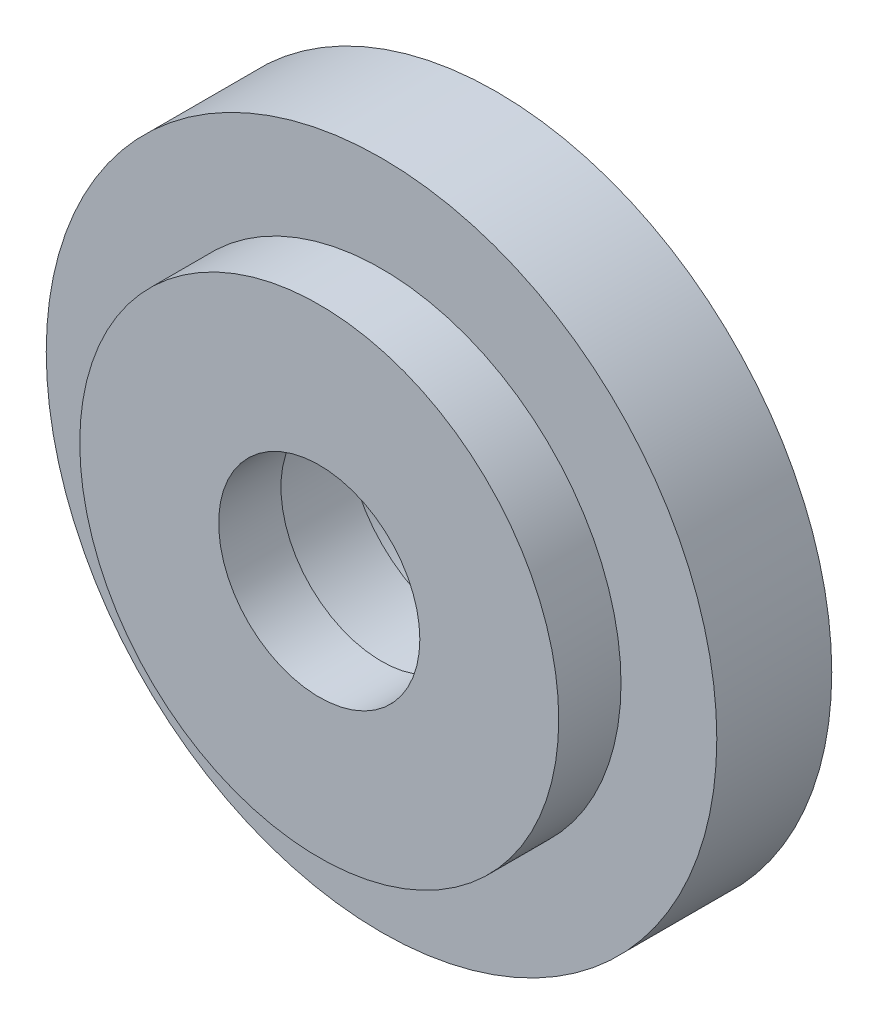
ISO-10303-21;
HEADER;
FILE_DESCRIPTION(('STEP AP214'),'2;1');
FILE_NAME('part.step','',(''),(''),'','','');
FILE_SCHEMA(('AUTOMOTIVE_DESIGN { 1 0 10303 214 1 1 1 1 }'));
ENDSEC;
DATA;
#1=APPLICATION_CONTEXT('core data for automotive mechanical design processes');
#2=APPLICATION_PROTOCOL_DEFINITION('international standard','automotive_design',2000,#1);
#3=PRODUCT_CONTEXT('',#1,'mechanical');
#4=PRODUCT('Part','Part','',(#3));
#5=PRODUCT_RELATED_PRODUCT_CATEGORY('part','',(#4));
#6=PRODUCT_DEFINITION_FORMATION('','',#4);
#7=PRODUCT_DEFINITION_CONTEXT('part definition',#1,'design');
#8=PRODUCT_DEFINITION('design','',#6,#7);
#9=PRODUCT_DEFINITION_SHAPE('','',#8);
#10=(LENGTH_UNIT() NAMED_UNIT(*) SI_UNIT(.MILLI.,.METRE.));
#11=(NAMED_UNIT(*) PLANE_ANGLE_UNIT() SI_UNIT($,.RADIAN.));
#12=(NAMED_UNIT(*) SI_UNIT($,.STERADIAN.) SOLID_ANGLE_UNIT());
#13=UNCERTAINTY_MEASURE_WITH_UNIT(LENGTH_MEASURE(1.E-05),#10,'distance_accuracy_value','');
#14=(GEOMETRIC_REPRESENTATION_CONTEXT(3) GLOBAL_UNCERTAINTY_ASSIGNED_CONTEXT((#13)) GLOBAL_UNIT_ASSIGNED_CONTEXT((#10,
#11,#12)) REPRESENTATION_CONTEXT('',''));
#15=CARTESIAN_POINT('',(0.,0.,0.));
#16=DIRECTION('',(0.,0.,1.));
#17=DIRECTION('',(1.,0.,0.));
#18=AXIS2_PLACEMENT_3D('',#15,#16,#17);
#19=CARTESIAN_POINT('',(0.,0.,12.7));
#20=DIRECTION('',(0.,0.,-1.));
#21=DIRECTION('',(-1.,0.,0.));
#22=AXIS2_PLACEMENT_3D('',#19,#20,#21);
#23=CYLINDRICAL_SURFACE('',#22,12.7);
#24=CARTESIAN_POINT('',(0.,0.,9.398));
#25=DIRECTION('',(0.,0.,1.));
#26=DIRECTION('',(1.,0.,0.));
#27=AXIS2_PLACEMENT_3D('',#24,#25,#26);
#28=CIRCLE('',#27,12.7);
#29=CARTESIAN_POINT('',(12.7,0.,9.398));
#30=VERTEX_POINT('',#29);
#31=EDGE_CURVE('E56',#30,#30,#28,.T.);
#32=ORIENTED_EDGE('',*,*,#31,.T.);
#33=EDGE_LOOP('',(#32));
#34=FACE_BOUND('',#33,.T.);
#35=CARTESIAN_POINT('',(0.,0.,12.7));
#36=DIRECTION('',(0.,0.,1.));
#37=DIRECTION('',(1.,0.,0.));
#38=AXIS2_PLACEMENT_3D('',#35,#36,#37);
#39=CIRCLE('',#38,12.7);
#40=CARTESIAN_POINT('',(12.7,0.,12.7));
#41=VERTEX_POINT('',#40);
#42=EDGE_CURVE('E47',#41,#41,#39,.T.);
#43=ORIENTED_EDGE('',*,*,#42,.F.);
#44=EDGE_LOOP('',(#43));
#45=FACE_BOUND('',#44,.T.);
#46=ADVANCED_FACE('F40',(#34,#45),#23,.T.);
#47=CARTESIAN_POINT('',(0.,0.,12.7));
#48=DIRECTION('',(0.,0.,1.));
#49=DIRECTION('',(1.,0.,0.));
#50=AXIS2_PLACEMENT_3D('',#47,#48,#49);
#51=PLANE('',#50);
#52=CARTESIAN_POINT('',(0.,0.,12.7));
#53=DIRECTION('',(0.,0.,1.));
#54=DIRECTION('',(1.,0.,0.));
#55=AXIS2_PLACEMENT_3D('',#52,#53,#54);
#56=CIRCLE('',#55,5.334);
#57=CARTESIAN_POINT('',(5.334,0.,12.7));
#58=VERTEX_POINT('',#57);
#59=EDGE_CURVE('E62',#58,#58,#56,.T.);
#60=ORIENTED_EDGE('',*,*,#59,.F.);
#61=EDGE_LOOP('',(#60));
#62=FACE_BOUND('',#61,.T.);
#63=ORIENTED_EDGE('',*,*,#42,.T.);
#64=EDGE_LOOP('',(#63));
#65=FACE_BOUND('',#64,.T.);
#66=ADVANCED_FACE('F100',(#62,#65),#51,.T.);
#67=CARTESIAN_POINT('',(0.,0.,9.398));
#68=DIRECTION('',(0.,0.,-1.));
#69=DIRECTION('',(-1.,0.,0.));
#70=AXIS2_PLACEMENT_3D('',#67,#68,#69);
#71=CYLINDRICAL_SURFACE('',#70,17.78);
#72=CARTESIAN_POINT('',(0.,0.,9.398));
#73=DIRECTION('',(0.,0.,1.));
#74=DIRECTION('',(1.,0.,0.));
#75=AXIS2_PLACEMENT_3D('',#72,#73,#74);
#76=CIRCLE('',#75,17.78);
#77=CARTESIAN_POINT('',(-17.78,0.,9.398));
#78=VERTEX_POINT('',#77);
#79=EDGE_CURVE('E58',#78,#78,#76,.T.);
#80=CARTESIAN_POINT('',(0.,0.,3.302));
#81=DIRECTION('',(0.,0.,1.));
#82=DIRECTION('',(1.,0.,0.));
#83=AXIS2_PLACEMENT_3D('',#80,#81,#82);
#84=CIRCLE('',#83,17.78);
#85=CARTESIAN_POINT('',(-17.78,0.,3.302));
#86=VERTEX_POINT('',#85);
#87=EDGE_CURVE('E66',#86,#86,#84,.T.);
#88=CARTESIAN_POINT('',(-17.78,0.,9.398));
#89=CARTESIAN_POINT('',(-17.78,0.,9.3345));
#90=CARTESIAN_POINT('',(-17.78,0.,9.271));
#91=CARTESIAN_POINT('',(-17.78,0.,9.144));
#92=CARTESIAN_POINT('',(-17.78,0.,9.0805));
#93=CARTESIAN_POINT('',(-17.78,0.,8.9535));
#94=CARTESIAN_POINT('',(-17.78,0.,8.89));
#95=CARTESIAN_POINT('',(-17.78,0.,8.763));
#96=CARTESIAN_POINT('',(-17.78,0.,8.6995));
#97=CARTESIAN_POINT('',(-17.78,0.,8.5725));
#98=CARTESIAN_POINT('',(-17.78,0.,8.509));
#99=CARTESIAN_POINT('',(-17.78,0.,8.382));
#100=CARTESIAN_POINT('',(-17.78,0.,8.3185));
#101=CARTESIAN_POINT('',(-17.78,0.,8.1915));
#102=CARTESIAN_POINT('',(-17.78,0.,8.128));
#103=CARTESIAN_POINT('',(-17.78,0.,8.001));
#104=CARTESIAN_POINT('',(-17.78,0.,7.9375));
#105=CARTESIAN_POINT('',(-17.78,0.,7.8105));
#106=CARTESIAN_POINT('',(-17.78,0.,7.747));
#107=CARTESIAN_POINT('',(-17.78,0.,7.62));
#108=CARTESIAN_POINT('',(-17.78,0.,7.5565));
#109=CARTESIAN_POINT('',(-17.78,0.,7.4295));
#110=CARTESIAN_POINT('',(-17.78,0.,7.366));
#111=CARTESIAN_POINT('',(-17.78,0.,7.239));
#112=CARTESIAN_POINT('',(-17.78,0.,7.1755));
#113=CARTESIAN_POINT('',(-17.78,0.,7.0485));
#114=CARTESIAN_POINT('',(-17.78,0.,6.985));
#115=CARTESIAN_POINT('',(-17.78,0.,6.858));
#116=CARTESIAN_POINT('',(-17.78,0.,6.7945));
#117=CARTESIAN_POINT('',(-17.78,0.,6.6675));
#118=CARTESIAN_POINT('',(-17.78,0.,6.604));
#119=CARTESIAN_POINT('',(-17.78,0.,6.477));
#120=CARTESIAN_POINT('',(-17.78,0.,6.4135));
#121=CARTESIAN_POINT('',(-17.78,0.,6.2865));
#122=CARTESIAN_POINT('',(-17.78,0.,6.223));
#123=CARTESIAN_POINT('',(-17.78,0.,6.096));
#124=CARTESIAN_POINT('',(-17.78,0.,6.0325));
#125=CARTESIAN_POINT('',(-17.78,0.,5.9055));
#126=CARTESIAN_POINT('',(-17.78,0.,5.842));
#127=CARTESIAN_POINT('',(-17.78,0.,5.715));
#128=CARTESIAN_POINT('',(-17.78,0.,5.6515));
#129=CARTESIAN_POINT('',(-17.78,0.,5.5245));
#130=CARTESIAN_POINT('',(-17.78,0.,5.461));
#131=CARTESIAN_POINT('',(-17.78,0.,5.334));
#132=CARTESIAN_POINT('',(-17.78,0.,5.2705));
#133=CARTESIAN_POINT('',(-17.78,0.,5.1435));
#134=CARTESIAN_POINT('',(-17.78,0.,5.08));
#135=CARTESIAN_POINT('',(-17.78,0.,4.953));
#136=CARTESIAN_POINT('',(-17.78,0.,4.8895));
#137=CARTESIAN_POINT('',(-17.78,0.,4.7625));
#138=CARTESIAN_POINT('',(-17.78,0.,4.699));
#139=CARTESIAN_POINT('',(-17.78,0.,4.572));
#140=CARTESIAN_POINT('',(-17.78,0.,4.5085));
#141=CARTESIAN_POINT('',(-17.78,0.,4.3815));
#142=CARTESIAN_POINT('',(-17.78,0.,4.318));
#143=CARTESIAN_POINT('',(-17.78,0.,4.191));
#144=CARTESIAN_POINT('',(-17.78,0.,4.1275));
#145=CARTESIAN_POINT('',(-17.78,0.,4.0005));
#146=CARTESIAN_POINT('',(-17.78,0.,3.937));
#147=CARTESIAN_POINT('',(-17.78,0.,3.81));
#148=CARTESIAN_POINT('',(-17.78,0.,3.7465));
#149=CARTESIAN_POINT('',(-17.78,0.,3.6195));
#150=CARTESIAN_POINT('',(-17.78,0.,3.556));
#151=CARTESIAN_POINT('',(-17.78,0.,3.429));
#152=CARTESIAN_POINT('',(-17.78,0.,3.3655));
#153=CARTESIAN_POINT('',(-17.78,0.,3.302));
#154=B_SPLINE_CURVE_WITH_KNOTS('',3,(#88,#89,#90,#91,#92,#93,#94,#95,#96,#97,#98,#99,#100,#101,
#102,#103,#104,#105,#106,#107,#108,#109,#110,#111,#112,#113,#114,#115,#116,#117,#118,#119,#120,
#121,#122,#123,#124,#125,#126,#127,#128,#129,#130,#131,#132,#133,#134,#135,#136,#137,#138,#139,
#140,#141,#142,#143,#144,#145,#146,#147,#148,#149,#150,#151,#152,#153),.UNSPECIFIED.,.F.,.F.,(4,
2,2,2,2,2,2,2,2,2,2,2,2,2,2,2,2,2,2,2,2,2,2,2,2,2,2,2,2,2,2,2,4),(0.,0.1905,0.380999999999999,
0.571499999999999,0.761999999999999,0.952499999999998,1.143,1.3335,1.524,1.7145,1.905,2.0955,
2.286,2.4765,2.667,2.8575,3.048,3.2385,3.429,3.6195,3.81,4.0005,4.191,4.3815,4.572,4.7625,4.953,
5.1435,5.334,5.5245,5.715,5.9055,6.096),.UNSPECIFIED.);
#155=EDGE_CURVE('BSEAM82',#78,#86,#154,.T.);
#156=ORIENTED_EDGE('',*,*,#79,.F.);
#157=ORIENTED_EDGE('',*,*,#87,.T.);
#158=ORIENTED_EDGE('',*,*,#155,.T.);
#159=ORIENTED_EDGE('',*,*,#155,.F.);
#160=EDGE_LOOP('',(#156,#158,#157,#159));
#161=FACE_BOUND('',#160,.T.);
#162=ADVANCED_FACE('F82',(#161),#71,.T.);
#163=CARTESIAN_POINT('',(0.,0.,9.398));
#164=DIRECTION('',(0.,0.,1.));
#165=DIRECTION('',(1.,0.,0.));
#166=AXIS2_PLACEMENT_3D('',#163,#164,#165);
#167=PLANE('',#166);
#168=ORIENTED_EDGE('',*,*,#31,.F.);
#169=EDGE_LOOP('',(#168));
#170=FACE_BOUND('',#169,.T.);
#171=ORIENTED_EDGE('',*,*,#79,.T.);
#172=EDGE_LOOP('',(#171));
#173=FACE_BOUND('',#172,.T.);
#174=ADVANCED_FACE('F87',(#170,#173),#167,.T.);
#175=CARTESIAN_POINT('',(0.,0.,3.302));
#176=DIRECTION('',(0.,0.,1.));
#177=DIRECTION('',(1.,0.,0.));
#178=AXIS2_PLACEMENT_3D('',#175,#176,#177);
#179=PLANE('',#178);
#180=CARTESIAN_POINT('',(0.,0.,3.302));
#181=DIRECTION('',(0.,0.,1.));
#182=DIRECTION('',(1.,0.,0.));
#183=AXIS2_PLACEMENT_3D('',#180,#181,#182);
#184=CIRCLE('',#183,12.7);
#185=CARTESIAN_POINT('',(12.7,0.,3.302));
#186=VERTEX_POINT('',#185);
#187=EDGE_CURVE('E12',#186,#186,#184,.T.);
#188=ORIENTED_EDGE('',*,*,#187,.T.);
#189=EDGE_LOOP('',(#188));
#190=FACE_BOUND('',#189,.T.);
#191=ORIENTED_EDGE('',*,*,#87,.F.);
#192=EDGE_LOOP('',(#191));
#193=FACE_BOUND('',#192,.T.);
#194=ADVANCED_FACE('F84',(#190,#193),#179,.F.);
#195=CARTESIAN_POINT('',(0.,0.,0.));
#196=DIRECTION('',(0.,0.,1.));
#197=DIRECTION('',(1.,0.,0.));
#198=AXIS2_PLACEMENT_3D('',#195,#196,#197);
#199=PLANE('',#198);
#200=CARTESIAN_POINT('',(0.,0.,0.));
#201=DIRECTION('',(0.,0.,-1.));
#202=DIRECTION('',(-1.,0.,0.));
#203=AXIS2_PLACEMENT_3D('',#200,#201,#202);
#204=CIRCLE('',#203,8.255);
#205=CARTESIAN_POINT('',(-8.255,0.,0.));
#206=VERTEX_POINT('',#205);
#207=EDGE_CURVE('E142',#206,#206,#204,.T.);
#208=ORIENTED_EDGE('',*,*,#207,.F.);
#209=EDGE_LOOP('',(#208));
#210=FACE_BOUND('',#209,.T.);
#211=CARTESIAN_POINT('',(0.,0.,0.));
#212=DIRECTION('',(0.,0.,1.));
#213=DIRECTION('',(1.,0.,0.));
#214=AXIS2_PLACEMENT_3D('',#211,#212,#213);
#215=CIRCLE('',#214,12.7);
#216=CARTESIAN_POINT('',(12.7,0.,0.));
#217=VERTEX_POINT('',#216);
#218=EDGE_CURVE('E52',#217,#217,#215,.T.);
#219=ORIENTED_EDGE('',*,*,#218,.F.);
#220=EDGE_LOOP('',(#219));
#221=FACE_BOUND('',#220,.T.);
#222=ADVANCED_FACE('F86',(#210,#221),#199,.F.);
#223=ORIENTED_EDGE('',*,*,#218,.T.);
#224=EDGE_LOOP('',(#223));
#225=FACE_BOUND('',#224,.T.);
#226=ORIENTED_EDGE('',*,*,#187,.F.);
#227=EDGE_LOOP('',(#226));
#228=FACE_BOUND('',#227,.T.);
#229=ADVANCED_FACE('F94',(#225,#228),#23,.T.);
#230=CARTESIAN_POINT('',(0.,0.,9.398));
#231=DIRECTION('',(0.,0.,1.));
#232=DIRECTION('',(1.,0.,0.));
#233=AXIS2_PLACEMENT_3D('',#230,#231,#232);
#234=PLANE('',#233);
#235=CARTESIAN_POINT('',(0.,0.,9.398));
#236=DIRECTION('',(0.,0.,1.));
#237=DIRECTION('',(1.,0.,0.));
#238=AXIS2_PLACEMENT_3D('',#235,#236,#237);
#239=CIRCLE('',#238,5.334);
#240=CARTESIAN_POINT('',(5.334,0.,9.398));
#241=VERTEX_POINT('',#240);
#242=EDGE_CURVE('E59',#241,#241,#239,.T.);
#243=ORIENTED_EDGE('',*,*,#242,.T.);
#244=EDGE_LOOP('',(#243));
#245=FACE_BOUND('',#244,.T.);
#246=CARTESIAN_POINT('',(0.,0.,9.398));
#247=DIRECTION('',(0.,0.,1.));
#248=DIRECTION('',(1.,0.,0.));
#249=AXIS2_PLACEMENT_3D('',#246,#247,#248);
#250=CIRCLE('',#249,6.4135);
#251=CARTESIAN_POINT('',(6.4135,0.,9.398));
#252=VERTEX_POINT('',#251);
#253=EDGE_CURVE('E61',#252,#252,#250,.F.);
#254=ORIENTED_EDGE('',*,*,#253,.T.);
#255=EDGE_LOOP('',(#254));
#256=FACE_BOUND('',#255,.T.);
#257=ADVANCED_FACE('F109',(#245,#256),#234,.F.);
#258=CARTESIAN_POINT('',(0.,0.,27.5381173645597));
#259=DIRECTION('',(0.,0.,-1.));
#260=DIRECTION('',(-1.,0.,0.));
#261=AXIS2_PLACEMENT_3D('',#258,#259,#260);
#262=CYLINDRICAL_SURFACE('',#261,6.4135);
#263=CARTESIAN_POINT('',(0.,0.,4.826));
#264=DIRECTION('',(0.,0.,1.));
#265=DIRECTION('',(1.,0.,0.));
#266=AXIS2_PLACEMENT_3D('',#263,#264,#265);
#267=CIRCLE('',#266,6.4135);
#268=CARTESIAN_POINT('',(6.4135,0.,4.826));
#269=VERTEX_POINT('',#268);
#270=EDGE_CURVE('E43',#269,#269,#267,.F.);
#271=ORIENTED_EDGE('',*,*,#270,.T.);
#272=EDGE_LOOP('',(#271));
#273=FACE_BOUND('',#272,.T.);
#274=ORIENTED_EDGE('',*,*,#253,.F.);
#275=EDGE_LOOP('',(#274));
#276=FACE_BOUND('',#275,.T.);
#277=ADVANCED_FACE('F114',(#273,#276),#262,.F.);
#278=CARTESIAN_POINT('',(0.,0.,0.));
#279=DIRECTION('',(0.,0.,1.));
#280=DIRECTION('',(1.,0.,0.));
#281=AXIS2_PLACEMENT_3D('',#278,#279,#280);
#282=CYLINDRICAL_SURFACE('',#281,5.334);
#283=ORIENTED_EDGE('',*,*,#59,.T.);
#284=EDGE_LOOP('',(#283));
#285=FACE_BOUND('',#284,.T.);
#286=ORIENTED_EDGE('',*,*,#242,.F.);
#287=EDGE_LOOP('',(#286));
#288=FACE_BOUND('',#287,.T.);
#289=ADVANCED_FACE('F124',(#285,#288),#282,.F.);
#290=CARTESIAN_POINT('',(0.,0.,4.826));
#291=DIRECTION('',(0.,0.,1.));
#292=DIRECTION('',(1.,0.,0.));
#293=AXIS2_PLACEMENT_3D('',#290,#291,#292);
#294=PLANE('',#293);
#295=CARTESIAN_POINT('',(0.,0.,4.826));
#296=DIRECTION('',(0.,0.,1.));
#297=DIRECTION('',(1.,0.,0.));
#298=AXIS2_PLACEMENT_3D('',#295,#296,#297);
#299=CIRCLE('',#298,8.255);
#300=CARTESIAN_POINT('',(8.255,0.,4.826));
#301=VERTEX_POINT('',#300);
#302=EDGE_CURVE('E73',#301,#301,#299,.F.);
#303=ORIENTED_EDGE('',*,*,#302,.T.);
#304=EDGE_LOOP('',(#303));
#305=FACE_BOUND('',#304,.T.);
#306=ORIENTED_EDGE('',*,*,#270,.F.);
#307=EDGE_LOOP('',(#306));
#308=FACE_BOUND('',#307,.T.);
#309=ADVANCED_FACE('F130',(#305,#308),#294,.F.);
#310=CARTESIAN_POINT('',(0.,0.,32.7466659147798));
#311=DIRECTION('',(0.,0.,-1.));
#312=DIRECTION('',(-1.,0.,0.));
#313=AXIS2_PLACEMENT_3D('',#310,#311,#312);
#314=CYLINDRICAL_SURFACE('',#313,8.255);
#315=ORIENTED_EDGE('',*,*,#207,.T.);
#316=EDGE_LOOP('',(#315));
#317=FACE_BOUND('',#316,.T.);
#318=ORIENTED_EDGE('',*,*,#302,.F.);
#319=EDGE_LOOP('',(#318));
#320=FACE_BOUND('',#319,.T.);
#321=ADVANCED_FACE('F133',(#317,#320),#314,.F.);
#322=CLOSED_SHELL('',(#46,#66,#162,#174,#194,#222,#229,#257,#277,#289,#309,#321));
#323=MANIFOLD_SOLID_BREP('B2',#322);
#324=ADVANCED_BREP_SHAPE_REPRESENTATION('',(#18,#323),#14);
#325=SHAPE_DEFINITION_REPRESENTATION(#9,#324);
ENDSEC;
END-ISO-10303-21;
